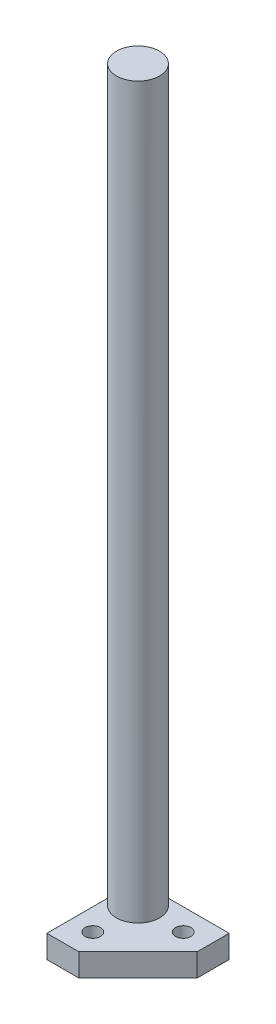
ISO-10303-21;
HEADER;
FILE_DESCRIPTION(('STEP AP214'),'2;1');
FILE_NAME('part.step','',(''),(''),'','','');
FILE_SCHEMA(('AUTOMOTIVE_DESIGN { 1 0 10303 214 1 1 1 1 }'));
ENDSEC;
DATA;
#1=APPLICATION_CONTEXT('core data for automotive mechanical design processes');
#2=APPLICATION_PROTOCOL_DEFINITION('international standard','automotive_design',2000,#1);
#3=PRODUCT_CONTEXT('',#1,'mechanical');
#4=PRODUCT('Part','Part','',(#3));
#5=PRODUCT_RELATED_PRODUCT_CATEGORY('part','',(#4));
#6=PRODUCT_DEFINITION_FORMATION('','',#4);
#7=PRODUCT_DEFINITION_CONTEXT('part definition',#1,'design');
#8=PRODUCT_DEFINITION('design','',#6,#7);
#9=PRODUCT_DEFINITION_SHAPE('','',#8);
#10=(LENGTH_UNIT() NAMED_UNIT(*) SI_UNIT(.MILLI.,.METRE.));
#11=(NAMED_UNIT(*) PLANE_ANGLE_UNIT() SI_UNIT($,.RADIAN.));
#12=(NAMED_UNIT(*) SI_UNIT($,.STERADIAN.) SOLID_ANGLE_UNIT());
#13=UNCERTAINTY_MEASURE_WITH_UNIT(LENGTH_MEASURE(1.E-05),#10,'distance_accuracy_value','');
#14=(GEOMETRIC_REPRESENTATION_CONTEXT(3) GLOBAL_UNCERTAINTY_ASSIGNED_CONTEXT((#13)) GLOBAL_UNIT_ASSIGNED_CONTEXT((#10,
#11,#12)) REPRESENTATION_CONTEXT('',''));
#15=CARTESIAN_POINT('',(0.,0.,0.));
#16=DIRECTION('',(0.,0.,1.));
#17=DIRECTION('',(1.,0.,0.));
#18=AXIS2_PLACEMENT_3D('',#15,#16,#17);
#19=CARTESIAN_POINT('',(0.,101.6,0.));
#20=DIRECTION('',(0.,-1.,0.));
#21=DIRECTION('',(0.,0.,-1.));
#22=AXIS2_PLACEMENT_3D('',#19,#20,#21);
#23=CYLINDRICAL_SURFACE('',#22,3.);
#24=CARTESIAN_POINT('',(0.,101.6,0.));
#25=DIRECTION('',(0.,1.,0.));
#26=DIRECTION('',(0.,0.,1.));
#27=AXIS2_PLACEMENT_3D('',#24,#25,#26);
#28=CIRCLE('',#27,3.);
#29=CARTESIAN_POINT('',(0.,101.6,3.));
#30=VERTEX_POINT('',#29);
#31=EDGE_CURVE('E11',#30,#30,#28,.T.);
#32=ORIENTED_EDGE('',*,*,#31,.F.);
#33=EDGE_LOOP('',(#32));
#34=FACE_BOUND('',#33,.T.);
#35=CARTESIAN_POINT('',(0.,0.,0.));
#36=DIRECTION('',(0.,1.,0.));
#37=DIRECTION('',(0.,0.,1.));
#38=AXIS2_PLACEMENT_3D('',#35,#36,#37);
#39=CIRCLE('',#38,3.);
#40=CARTESIAN_POINT('',(-3.,0.,0.));
#41=VERTEX_POINT('',#40);
#42=CARTESIAN_POINT('',(0.,0.,-3.));
#43=VERTEX_POINT('',#42);
#44=EDGE_CURVE('E51',#41,#43,#39,.T.);
#45=ORIENTED_EDGE('',*,*,#44,.T.);
#46=DIRECTION('',(0.,1.,0.));
#47=VECTOR('',#46,1.);
#48=CARTESIAN_POINT('',(0.,-3.175,-3.));
#49=LINE('',#48,#47);
#50=CARTESIAN_POINT('',(0.,-3.175,-3.));
#51=VERTEX_POINT('',#50);
#52=EDGE_CURVE('E66',#51,#43,#49,.T.);
#53=ORIENTED_EDGE('',*,*,#52,.F.);
#54=CARTESIAN_POINT('',(0.,-3.175,0.));
#55=DIRECTION('',(0.,-1.,0.));
#56=DIRECTION('',(0.,0.,-1.));
#57=AXIS2_PLACEMENT_3D('',#54,#55,#56);
#58=CIRCLE('',#57,3.);
#59=CARTESIAN_POINT('',(-3.,-3.175,0.));
#60=VERTEX_POINT('',#59);
#61=EDGE_CURVE('E169',#60,#51,#58,.T.);
#62=ORIENTED_EDGE('',*,*,#61,.F.);
#63=DIRECTION('',(0.,1.,0.));
#64=VECTOR('',#63,1.);
#65=CARTESIAN_POINT('',(-3.,-3.175,0.));
#66=LINE('',#65,#64);
#67=EDGE_CURVE('E150',#60,#41,#66,.T.);
#68=ORIENTED_EDGE('',*,*,#67,.T.);
#69=EDGE_LOOP('',(#45,#53,#62,#68));
#70=FACE_BOUND('',#69,.T.);
#71=ADVANCED_FACE('F48',(#34,#70),#23,.T.);
#72=CARTESIAN_POINT('',(0.,101.6,0.));
#73=DIRECTION('',(0.,1.,0.));
#74=DIRECTION('',(0.,0.,1.));
#75=AXIS2_PLACEMENT_3D('',#72,#73,#74);
#76=PLANE('',#75);
#77=ORIENTED_EDGE('',*,*,#31,.T.);
#78=EDGE_LOOP('',(#77));
#79=FACE_BOUND('',#78,.T.);
#80=ADVANCED_FACE('F202',(#79),#76,.T.);
#81=CARTESIAN_POINT('',(0.,-3.175,0.));
#82=DIRECTION('',(0.,-1.,0.));
#83=DIRECTION('',(0.,0.,-1.));
#84=AXIS2_PLACEMENT_3D('',#81,#82,#83);
#85=PLANE('',#84);
#86=CARTESIAN_POINT('',(0.0479999999999994,-3.175,6.34981858008558));
#87=DIRECTION('',(0.,-1.,0.));
#88=DIRECTION('',(0.,0.,-1.));
#89=AXIS2_PLACEMENT_3D('',#86,#87,#88);
#90=CIRCLE('',#89,1.0795);
#91=CARTESIAN_POINT('',(0.0479999999999994,-3.175,5.27031858008558));
#92=VERTEX_POINT('',#91);
#93=EDGE_CURVE('E158',#92,#92,#90,.T.);
#94=ORIENTED_EDGE('',*,*,#93,.F.);
#95=EDGE_LOOP('',(#94));
#96=FACE_BOUND('',#95,.T.);
#97=ORIENTED_EDGE('',*,*,#61,.T.);
#98=DIRECTION('',(1.,0.,0.));
#99=VECTOR('',#98,1.);
#100=CARTESIAN_POINT('',(9.7,-3.175,-3.));
#101=LINE('',#100,#99);
#102=CARTESIAN_POINT('',(9.7,-3.175,-3.));
#103=VERTEX_POINT('',#102);
#104=EDGE_CURVE('E109',#51,#103,#101,.T.);
#105=ORIENTED_EDGE('',*,*,#104,.T.);
#106=DIRECTION('',(0.,0.,1.));
#107=VECTOR('',#106,1.);
#108=CARTESIAN_POINT('',(9.7,-3.175,1.445));
#109=LINE('',#108,#107);
#110=CARTESIAN_POINT('',(9.7,-3.175,1.445));
#111=VERTEX_POINT('',#110);
#112=EDGE_CURVE('E126',#103,#111,#109,.T.);
#113=ORIENTED_EDGE('',*,*,#112,.T.);
#114=DIRECTION('',(-0.707106781186548,0.,0.707106781186548));
#115=VECTOR('',#114,1.);
#116=CARTESIAN_POINT('',(1.445,-3.175,9.7));
#117=LINE('',#116,#115);
#118=CARTESIAN_POINT('',(1.445,-3.175,9.7));
#119=VERTEX_POINT('',#118);
#120=EDGE_CURVE('E118',#111,#119,#117,.T.);
#121=ORIENTED_EDGE('',*,*,#120,.T.);
#122=DIRECTION('',(-1.,0.,0.));
#123=VECTOR('',#122,1.);
#124=CARTESIAN_POINT('',(-3.,-3.175,9.7));
#125=LINE('',#124,#123);
#126=CARTESIAN_POINT('',(-3.,-3.175,9.7));
#127=VERTEX_POINT('',#126);
#128=EDGE_CURVE('E123',#119,#127,#125,.T.);
#129=ORIENTED_EDGE('',*,*,#128,.T.);
#130=DIRECTION('',(0.,0.,-1.));
#131=VECTOR('',#130,1.);
#132=CARTESIAN_POINT('',(-3.,-3.175,0.));
#133=LINE('',#132,#131);
#134=EDGE_CURVE('E76',#127,#60,#133,.T.);
#135=ORIENTED_EDGE('',*,*,#134,.T.);
#136=EDGE_LOOP('',(#97,#105,#113,#121,#129,#135));
#137=FACE_BOUND('',#136,.T.);
#138=CARTESIAN_POINT('',(6.34981858008558,-3.175,0.0480000000000002));
#139=DIRECTION('',(0.,-1.,0.));
#140=DIRECTION('',(0.,0.,-1.));
#141=AXIS2_PLACEMENT_3D('',#138,#139,#140);
#142=CIRCLE('',#141,1.0795);
#143=CARTESIAN_POINT('',(6.34981858008558,-3.175,-1.0315));
#144=VERTEX_POINT('',#143);
#145=EDGE_CURVE('E296',#144,#144,#142,.T.);
#146=ORIENTED_EDGE('',*,*,#145,.F.);
#147=EDGE_LOOP('',(#146));
#148=FACE_BOUND('',#147,.T.);
#149=ADVANCED_FACE('F120',(#96,#137,#148),#85,.T.);
#150=CARTESIAN_POINT('',(0.,0.,0.));
#151=DIRECTION('',(0.,-1.,0.));
#152=DIRECTION('',(0.,0.,-1.));
#153=AXIS2_PLACEMENT_3D('',#150,#151,#152);
#154=PLANE('',#153);
#155=ORIENTED_EDGE('',*,*,#44,.F.);
#156=DIRECTION('',(0.,0.,-1.));
#157=VECTOR('',#156,1.);
#158=CARTESIAN_POINT('',(-3.,0.,0.));
#159=LINE('',#158,#157);
#160=CARTESIAN_POINT('',(-3.,0.,9.7));
#161=VERTEX_POINT('',#160);
#162=EDGE_CURVE('E166',#161,#41,#159,.T.);
#163=ORIENTED_EDGE('',*,*,#162,.F.);
#164=DIRECTION('',(-1.,0.,0.));
#165=VECTOR('',#164,1.);
#166=CARTESIAN_POINT('',(-3.,0.,9.7));
#167=LINE('',#166,#165);
#168=CARTESIAN_POINT('',(1.445,0.,9.7));
#169=VERTEX_POINT('',#168);
#170=EDGE_CURVE('E163',#169,#161,#167,.T.);
#171=ORIENTED_EDGE('',*,*,#170,.F.);
#172=DIRECTION('',(-0.707106781186548,0.,0.707106781186548));
#173=VECTOR('',#172,1.);
#174=CARTESIAN_POINT('',(1.445,0.,9.7));
#175=LINE('',#174,#173);
#176=CARTESIAN_POINT('',(9.7,0.,1.445));
#177=VERTEX_POINT('',#176);
#178=EDGE_CURVE('E136',#177,#169,#175,.T.);
#179=ORIENTED_EDGE('',*,*,#178,.F.);
#180=DIRECTION('',(0.,0.,1.));
#181=VECTOR('',#180,1.);
#182=CARTESIAN_POINT('',(9.7,0.,1.445));
#183=LINE('',#182,#181);
#184=CARTESIAN_POINT('',(9.7,0.,-3.));
#185=VERTEX_POINT('',#184);
#186=EDGE_CURVE('E157',#185,#177,#183,.T.);
#187=ORIENTED_EDGE('',*,*,#186,.F.);
#188=DIRECTION('',(1.,0.,0.));
#189=VECTOR('',#188,1.);
#190=CARTESIAN_POINT('',(9.7,0.,-3.));
#191=LINE('',#190,#189);
#192=EDGE_CURVE('E154',#43,#185,#191,.T.);
#193=ORIENTED_EDGE('',*,*,#192,.F.);
#194=EDGE_LOOP('',(#155,#163,#171,#179,#187,#193));
#195=FACE_BOUND('',#194,.T.);
#196=CARTESIAN_POINT('',(0.0479999999999994,0.,6.34981858008558));
#197=DIRECTION('',(0.,-1.,0.));
#198=DIRECTION('',(0.,0.,-1.));
#199=AXIS2_PLACEMENT_3D('',#196,#197,#198);
#200=CIRCLE('',#199,1.0795);
#201=CARTESIAN_POINT('',(0.0479999999999994,0.,5.27031858008558));
#202=VERTEX_POINT('',#201);
#203=EDGE_CURVE('E304',#202,#202,#200,.T.);
#204=ORIENTED_EDGE('',*,*,#203,.T.);
#205=EDGE_LOOP('',(#204));
#206=FACE_BOUND('',#205,.T.);
#207=CARTESIAN_POINT('',(6.34981858008558,0.,0.0480000000000002));
#208=DIRECTION('',(0.,-1.,0.));
#209=DIRECTION('',(0.,0.,-1.));
#210=AXIS2_PLACEMENT_3D('',#207,#208,#209);
#211=CIRCLE('',#210,1.0795);
#212=CARTESIAN_POINT('',(6.34981858008558,0.,-1.0315));
#213=VERTEX_POINT('',#212);
#214=EDGE_CURVE('E299',#213,#213,#211,.T.);
#215=ORIENTED_EDGE('',*,*,#214,.T.);
#216=EDGE_LOOP('',(#215));
#217=FACE_BOUND('',#216,.T.);
#218=ADVANCED_FACE('F187',(#195,#206,#217),#154,.F.);
#219=CARTESIAN_POINT('',(9.7,-3.175,-3.));
#220=DIRECTION('',(0.,0.,1.));
#221=DIRECTION('',(1.,0.,0.));
#222=AXIS2_PLACEMENT_3D('',#219,#220,#221);
#223=PLANE('',#222);
#224=ORIENTED_EDGE('',*,*,#192,.T.);
#225=DIRECTION('',(0.,1.,0.));
#226=VECTOR('',#225,1.);
#227=CARTESIAN_POINT('',(9.7,-3.175,-3.));
#228=LINE('',#227,#226);
#229=EDGE_CURVE('E177',#103,#185,#228,.T.);
#230=ORIENTED_EDGE('',*,*,#229,.F.);
#231=ORIENTED_EDGE('',*,*,#104,.F.);
#232=ORIENTED_EDGE('',*,*,#52,.T.);
#233=EDGE_LOOP('',(#224,#230,#231,#232));
#234=FACE_BOUND('',#233,.T.);
#235=ADVANCED_FACE('F192',(#234),#223,.F.);
#236=CARTESIAN_POINT('',(9.7,-3.175,1.445));
#237=DIRECTION('',(-1.,0.,0.));
#238=DIRECTION('',(0.,0.,1.));
#239=AXIS2_PLACEMENT_3D('',#236,#237,#238);
#240=PLANE('',#239);
#241=ORIENTED_EDGE('',*,*,#186,.T.);
#242=DIRECTION('',(0.,1.,0.));
#243=VECTOR('',#242,1.);
#244=CARTESIAN_POINT('',(9.7,-3.175,1.445));
#245=LINE('',#244,#243);
#246=EDGE_CURVE('E140',#111,#177,#245,.T.);
#247=ORIENTED_EDGE('',*,*,#246,.F.);
#248=ORIENTED_EDGE('',*,*,#112,.F.);
#249=ORIENTED_EDGE('',*,*,#229,.T.);
#250=EDGE_LOOP('',(#241,#247,#248,#249));
#251=FACE_BOUND('',#250,.T.);
#252=ADVANCED_FACE('F191',(#251),#240,.F.);
#253=CARTESIAN_POINT('',(1.445,-3.175,9.7));
#254=DIRECTION('',(-0.707106781186548,0.,-0.707106781186548));
#255=DIRECTION('',(-0.707106781186548,0.,0.707106781186548));
#256=AXIS2_PLACEMENT_3D('',#253,#254,#255);
#257=PLANE('',#256);
#258=ORIENTED_EDGE('',*,*,#178,.T.);
#259=DIRECTION('',(0.,1.,0.));
#260=VECTOR('',#259,1.);
#261=CARTESIAN_POINT('',(1.445,-3.175,9.7));
#262=LINE('',#261,#260);
#263=EDGE_CURVE('E133',#119,#169,#262,.T.);
#264=ORIENTED_EDGE('',*,*,#263,.F.);
#265=ORIENTED_EDGE('',*,*,#120,.F.);
#266=ORIENTED_EDGE('',*,*,#246,.T.);
#267=EDGE_LOOP('',(#258,#264,#265,#266));
#268=FACE_BOUND('',#267,.T.);
#269=ADVANCED_FACE('F134',(#268),#257,.F.);
#270=CARTESIAN_POINT('',(-3.,-3.175,9.7));
#271=DIRECTION('',(0.,0.,-1.));
#272=DIRECTION('',(-1.,0.,0.));
#273=AXIS2_PLACEMENT_3D('',#270,#271,#272);
#274=PLANE('',#273);
#275=ORIENTED_EDGE('',*,*,#170,.T.);
#276=DIRECTION('',(0.,1.,0.));
#277=VECTOR('',#276,1.);
#278=CARTESIAN_POINT('',(-3.,-3.175,9.7));
#279=LINE('',#278,#277);
#280=EDGE_CURVE('E141',#127,#161,#279,.T.);
#281=ORIENTED_EDGE('',*,*,#280,.F.);
#282=ORIENTED_EDGE('',*,*,#128,.F.);
#283=ORIENTED_EDGE('',*,*,#263,.T.);
#284=EDGE_LOOP('',(#275,#281,#282,#283));
#285=FACE_BOUND('',#284,.T.);
#286=ADVANCED_FACE('F143',(#285),#274,.F.);
#287=CARTESIAN_POINT('',(-3.,-3.175,0.));
#288=DIRECTION('',(1.,0.,0.));
#289=DIRECTION('',(0.,0.,-1.));
#290=AXIS2_PLACEMENT_3D('',#287,#288,#289);
#291=PLANE('',#290);
#292=ORIENTED_EDGE('',*,*,#162,.T.);
#293=ORIENTED_EDGE('',*,*,#67,.F.);
#294=ORIENTED_EDGE('',*,*,#134,.F.);
#295=ORIENTED_EDGE('',*,*,#280,.T.);
#296=EDGE_LOOP('',(#292,#293,#294,#295));
#297=FACE_BOUND('',#296,.T.);
#298=ADVANCED_FACE('F186',(#297),#291,.F.);
#299=CARTESIAN_POINT('',(0.0479999999999994,-3.175,6.34981858008558));
#300=DIRECTION('',(0.,1.,0.));
#301=DIRECTION('',(0.,0.,1.));
#302=AXIS2_PLACEMENT_3D('',#299,#300,#301);
#303=CYLINDRICAL_SURFACE('',#302,1.0795);
#304=ORIENTED_EDGE('',*,*,#93,.T.);
#305=EDGE_LOOP('',(#304));
#306=FACE_BOUND('',#305,.T.);
#307=ORIENTED_EDGE('',*,*,#203,.F.);
#308=EDGE_LOOP('',(#307));
#309=FACE_BOUND('',#308,.T.);
#310=ADVANCED_FACE('F217',(#306,#309),#303,.F.);
#311=CARTESIAN_POINT('',(6.34981858008558,-3.175,0.0480000000000002));
#312=DIRECTION('',(0.,1.,0.));
#313=DIRECTION('',(0.,0.,1.));
#314=AXIS2_PLACEMENT_3D('',#311,#312,#313);
#315=CYLINDRICAL_SURFACE('',#314,1.0795);
#316=ORIENTED_EDGE('',*,*,#145,.T.);
#317=EDGE_LOOP('',(#316));
#318=FACE_BOUND('',#317,.T.);
#319=ORIENTED_EDGE('',*,*,#214,.F.);
#320=EDGE_LOOP('',(#319));
#321=FACE_BOUND('',#320,.T.);
#322=ADVANCED_FACE('F246',(#318,#321),#315,.F.);
#323=CLOSED_SHELL('',(#71,#80,#149,#218,#235,#252,#269,#286,#298,#310,#322));
#324=MANIFOLD_SOLID_BREP('B2',#323);
#325=ADVANCED_BREP_SHAPE_REPRESENTATION('',(#18,#324),#14);
#326=SHAPE_DEFINITION_REPRESENTATION(#9,#325);
ENDSEC;
END-ISO-10303-21;
